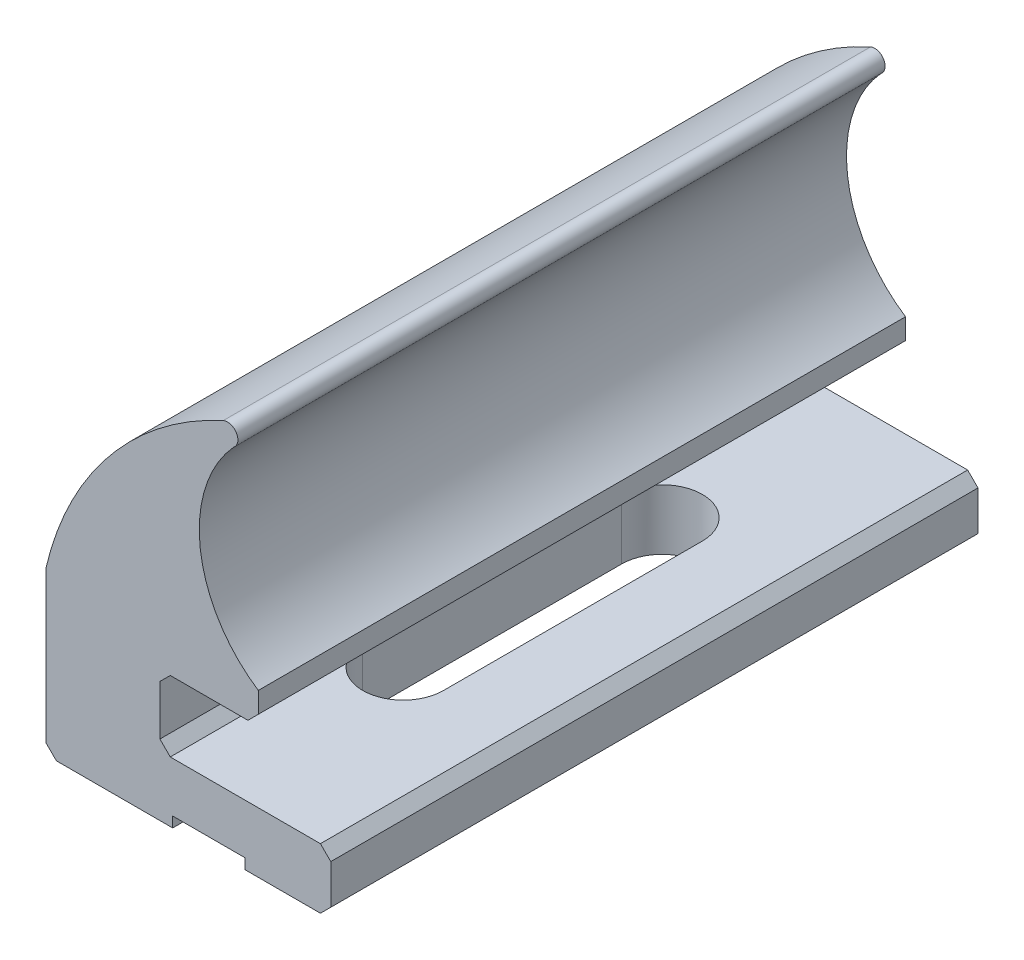
ISO-10303-21;
HEADER;
FILE_DESCRIPTION(('STEP AP214'),'2;1');
FILE_NAME('part.step','',(''),(''),'','','');
FILE_SCHEMA(('AUTOMOTIVE_DESIGN { 1 0 10303 214 1 1 1 1 }'));
ENDSEC;
DATA;
#1=APPLICATION_CONTEXT('core data for automotive mechanical design processes');
#2=APPLICATION_PROTOCOL_DEFINITION('international standard','automotive_design',2000,#1);
#3=PRODUCT_CONTEXT('',#1,'mechanical');
#4=PRODUCT('Part','Part','',(#3));
#5=PRODUCT_RELATED_PRODUCT_CATEGORY('part','',(#4));
#6=PRODUCT_DEFINITION_FORMATION('','',#4);
#7=PRODUCT_DEFINITION_CONTEXT('part definition',#1,'design');
#8=PRODUCT_DEFINITION('design','',#6,#7);
#9=PRODUCT_DEFINITION_SHAPE('','',#8);
#10=(LENGTH_UNIT() NAMED_UNIT(*) SI_UNIT(.MILLI.,.METRE.));
#11=(NAMED_UNIT(*) PLANE_ANGLE_UNIT() SI_UNIT($,.RADIAN.));
#12=(NAMED_UNIT(*) SI_UNIT($,.STERADIAN.) SOLID_ANGLE_UNIT());
#13=UNCERTAINTY_MEASURE_WITH_UNIT(LENGTH_MEASURE(1.E-05),#10,'distance_accuracy_value','');
#14=(GEOMETRIC_REPRESENTATION_CONTEXT(3) GLOBAL_UNCERTAINTY_ASSIGNED_CONTEXT((#13)) GLOBAL_UNIT_ASSIGNED_CONTEXT((#10,
#11,#12)) REPRESENTATION_CONTEXT('',''));
#15=CARTESIAN_POINT('',(0.,0.,0.));
#16=DIRECTION('',(0.,0.,1.));
#17=DIRECTION('',(1.,0.,0.));
#18=AXIS2_PLACEMENT_3D('',#15,#16,#17);
#19=CARTESIAN_POINT('',(0.,0.,-31.75));
#20=DIRECTION('',(0.,0.,-1.));
#21=DIRECTION('',(-1.,0.,0.));
#22=AXIS2_PLACEMENT_3D('',#19,#20,#21);
#23=PLANE('',#22);
#24=DIRECTION('',(1.,0.,0.));
#25=VECTOR('',#24,1.);
#26=CARTESIAN_POINT('',(0.,12.7,-31.75));
#27=LINE('',#26,#25);
#28=CARTESIAN_POINT('',(0.508000000000001,12.7,-31.75));
#29=VERTEX_POINT('',#28);
#30=CARTESIAN_POINT('',(13.462,12.7,-31.75));
#31=VERTEX_POINT('',#30);
#32=EDGE_CURVE('E275',#29,#31,#27,.T.);
#33=ORIENTED_EDGE('',*,*,#32,.F.);
#34=DIRECTION('',(0.70710678118655,-0.707106781186545,0.));
#35=VECTOR('',#34,1.);
#36=CARTESIAN_POINT('',(6.604,6.60400000000004,-31.75));
#37=LINE('',#36,#35);
#38=CARTESIAN_POINT('',(0.,13.208,-31.75));
#39=VERTEX_POINT('',#38);
#40=EDGE_CURVE('E315',#29,#39,#37,.F.);
#41=ORIENTED_EDGE('',*,*,#40,.T.);
#42=DIRECTION('',(0.,-1.,0.));
#43=VECTOR('',#42,1.);
#44=CARTESIAN_POINT('',(0.,12.7,-31.75));
#45=LINE('',#44,#43);
#46=CARTESIAN_POINT('',(0.,20.6433343911841,-31.75));
#47=VERTEX_POINT('',#46);
#48=EDGE_CURVE('E278',#47,#39,#45,.T.);
#49=ORIENTED_EDGE('',*,*,#48,.F.);
#50=CARTESIAN_POINT('',(15.1248827447145,17.1079918016303,-31.75));
#51=DIRECTION('',(0.,0.,-1.));
#52=DIRECTION('',(-1.,0.,0.));
#53=AXIS2_PLACEMENT_3D('',#50,#51,#52);
#54=CIRCLE('',#53,15.5325698217287);
#55=CARTESIAN_POINT('',(8.69449523293565,31.2469748525868,-31.75));
#56=VERTEX_POINT('',#55);
#57=EDGE_CURVE('E282',#56,#47,#54,.F.);
#58=ORIENTED_EDGE('',*,*,#57,.F.);
#59=CARTESIAN_POINT('',(8.90513301742173,30.7838295041479,-31.75));
#60=DIRECTION('',(0.,0.,-1.));
#61=DIRECTION('',(-1.,0.,0.));
#62=AXIS2_PLACEMENT_3D('',#59,#60,#61);
#63=CIRCLE('',#62,0.508794545994505);
#64=CARTESIAN_POINT('',(9.20630180988808,30.3737450634798,-31.75));
#65=VERTEX_POINT('',#64);
#66=EDGE_CURVE('E286',#65,#56,#63,.F.);
#67=ORIENTED_EDGE('',*,*,#66,.F.);
#68=CARTESIAN_POINT('',(13.97,26.0248429330683,-31.75));
#69=DIRECTION('',(0.,0.,-1.));
#70=DIRECTION('',(-1.,0.,0.));
#71=AXIS2_PLACEMENT_3D('',#68,#69,#70);
#72=CIRCLE('',#71,6.45025349783811);
#73=CARTESIAN_POINT('',(10.414,20.6433343911841,-31.75));
#74=VERTEX_POINT('',#73);
#75=EDGE_CURVE('E255',#74,#65,#72,.T.);
#76=ORIENTED_EDGE('',*,*,#75,.F.);
#77=DIRECTION('',(0.,1.,0.));
#78=VECTOR('',#77,1.);
#79=CARTESIAN_POINT('',(10.414,19.1193343911841,-31.75));
#80=LINE('',#79,#78);
#81=CARTESIAN_POINT('',(10.414,19.6273343911841,-31.75));
#82=VERTEX_POINT('',#81);
#83=EDGE_CURVE('E260',#82,#74,#80,.T.);
#84=ORIENTED_EDGE('',*,*,#83,.F.);
#85=DIRECTION('',(0.707106781186543,0.707106781186552,0.));
#86=VECTOR('',#85,1.);
#87=CARTESIAN_POINT('',(-4.60666719559199,4.60666719559193,-31.75));
#88=LINE('',#87,#86);
#89=CARTESIAN_POINT('',(9.906,19.1193343911841,-31.75));
#90=VERTEX_POINT('',#89);
#91=EDGE_CURVE('E313',#82,#90,#88,.F.);
#92=ORIENTED_EDGE('',*,*,#91,.T.);
#93=DIRECTION('',(1.,0.,0.));
#94=VECTOR('',#93,1.);
#95=CARTESIAN_POINT('',(5.588,19.1193343911841,-31.75));
#96=LINE('',#95,#94);
#97=CARTESIAN_POINT('',(6.09599999999999,19.1193343911841,-31.75));
#98=VERTEX_POINT('',#97);
#99=EDGE_CURVE('E263',#98,#90,#96,.T.);
#100=ORIENTED_EDGE('',*,*,#99,.F.);
#101=DIRECTION('',(0.707106781186543,0.707106781186552,0.));
#102=VECTOR('',#101,1.);
#103=CARTESIAN_POINT('',(5.588,18.6113343911841,-31.75));
#104=LINE('',#103,#102);
#105=CARTESIAN_POINT('',(5.588,18.6113343911841,-31.75));
#106=VERTEX_POINT('',#105);
#107=EDGE_CURVE('E11',#98,#106,#104,.F.);
#108=ORIENTED_EDGE('',*,*,#107,.T.);
#109=DIRECTION('',(0.,1.,0.));
#110=VECTOR('',#109,1.);
#111=CARTESIAN_POINT('',(5.588,15.6566370525685,-31.75));
#112=LINE('',#111,#110);
#113=CARTESIAN_POINT('',(5.588,16.1646370525685,-31.75));
#114=VERTEX_POINT('',#113);
#115=EDGE_CURVE('E266',#114,#106,#112,.T.);
#116=ORIENTED_EDGE('',*,*,#115,.F.);
#117=DIRECTION('',(-0.707106781186552,0.707106781186543,0.));
#118=VECTOR('',#117,1.);
#119=CARTESIAN_POINT('',(6.096,15.6566370525685,-31.75));
#120=LINE('',#119,#118);
#121=CARTESIAN_POINT('',(6.096,15.6566370525685,-31.75));
#122=VERTEX_POINT('',#121);
#123=EDGE_CURVE('E342',#114,#122,#120,.F.);
#124=ORIENTED_EDGE('',*,*,#123,.T.);
#125=DIRECTION('',(-1.,0.,0.));
#126=VECTOR('',#125,1.);
#127=CARTESIAN_POINT('',(13.97,15.6566370525685,-31.75));
#128=LINE('',#127,#126);
#129=CARTESIAN_POINT('',(13.462,15.6566370525685,-31.75));
#130=VERTEX_POINT('',#129);
#131=EDGE_CURVE('E269',#130,#122,#128,.T.);
#132=ORIENTED_EDGE('',*,*,#131,.F.);
#133=DIRECTION('',(-0.707106781186555,0.70710678118654,0.));
#134=VECTOR('',#133,1.);
#135=CARTESIAN_POINT('',(14.5593185262841,14.5593185262844,-31.75));
#136=LINE('',#135,#134);
#137=CARTESIAN_POINT('',(13.97,15.1486370525685,-31.75));
#138=VERTEX_POINT('',#137);
#139=EDGE_CURVE('E309',#130,#138,#136,.F.);
#140=ORIENTED_EDGE('',*,*,#139,.T.);
#141=DIRECTION('',(0.,1.,0.));
#142=VECTOR('',#141,1.);
#143=CARTESIAN_POINT('',(13.97,12.7,-31.75));
#144=LINE('',#143,#142);
#145=CARTESIAN_POINT('',(13.97,13.208,-31.75));
#146=VERTEX_POINT('',#145);
#147=EDGE_CURVE('E272',#146,#138,#144,.T.);
#148=ORIENTED_EDGE('',*,*,#147,.F.);
#149=DIRECTION('',(0.707106781186545,0.70710678118655,0.));
#150=VECTOR('',#149,1.);
#151=CARTESIAN_POINT('',(0.381000000000043,-0.38100000000004,-31.75));
#152=LINE('',#151,#150);
#153=EDGE_CURVE('E311',#146,#31,#152,.F.);
#154=ORIENTED_EDGE('',*,*,#153,.T.);
#155=EDGE_LOOP('',(#33,#41,#49,#58,#67,#76,#84,#92,#100,#108,#116,#124,#132,#140,#148,#154));
#156=FACE_BOUND('',#155,.T.);
#157=ADVANCED_FACE('F39',(#156),#23,.T.);
#158=CARTESIAN_POINT('',(13.97,26.0248429330683,0.));
#159=DIRECTION('',(0.,0.,1.));
#160=DIRECTION('',(1.,0.,0.));
#161=AXIS2_PLACEMENT_3D('',#158,#159,#160);
#162=PLANE('',#161);
#163=DIRECTION('',(0.,-1.,0.));
#164=VECTOR('',#163,1.);
#165=CARTESIAN_POINT('',(6.21522901844928,12.192,0.));
#166=LINE('',#165,#164);
#167=CARTESIAN_POINT('',(6.21522901844928,13.208,0.));
#168=VERTEX_POINT('',#167);
#169=CARTESIAN_POINT('',(6.21522901844928,12.7,0.));
#170=VERTEX_POINT('',#169);
#171=EDGE_CURVE('E206',#168,#170,#166,.T.);
#172=ORIENTED_EDGE('',*,*,#171,.F.);
#173=DIRECTION('',(-1.,0.,0.));
#174=VECTOR('',#173,1.);
#175=CARTESIAN_POINT('',(6.21522901844928,13.208,0.));
#176=LINE('',#175,#174);
#177=CARTESIAN_POINT('',(9.77122901844928,13.208,0.));
#178=VERTEX_POINT('',#177);
#179=EDGE_CURVE('E218',#178,#168,#176,.T.);
#180=ORIENTED_EDGE('',*,*,#179,.F.);
#181=DIRECTION('',(0.,1.,0.));
#182=VECTOR('',#181,1.);
#183=CARTESIAN_POINT('',(9.77122901844928,12.192,0.));
#184=LINE('',#183,#182);
#185=CARTESIAN_POINT('',(9.77122901844928,12.7,0.));
#186=VERTEX_POINT('',#185);
#187=EDGE_CURVE('E639',#186,#178,#184,.T.);
#188=ORIENTED_EDGE('',*,*,#187,.F.);
#189=DIRECTION('',(1.,0.,0.));
#190=VECTOR('',#189,1.);
#191=CARTESIAN_POINT('',(0.,12.7,0.));
#192=LINE('',#191,#190);
#193=CARTESIAN_POINT('',(13.462,12.7,0.));
#194=VERTEX_POINT('',#193);
#195=EDGE_CURVE('E234',#186,#194,#192,.T.);
#196=ORIENTED_EDGE('',*,*,#195,.T.);
#197=DIRECTION('',(-0.707106781186545,-0.70710678118655,0.));
#198=VECTOR('',#197,1.);
#199=CARTESIAN_POINT('',(20.3784214665342,19.6164214665342,0.));
#200=LINE('',#199,#198);
#201=CARTESIAN_POINT('',(13.97,13.208,0.));
#202=VERTEX_POINT('',#201);
#203=EDGE_CURVE('E299',#194,#202,#200,.F.);
#204=ORIENTED_EDGE('',*,*,#203,.T.);
#205=DIRECTION('',(0.,1.,0.));
#206=VECTOR('',#205,1.);
#207=CARTESIAN_POINT('',(13.97,12.7,0.));
#208=LINE('',#207,#206);
#209=CARTESIAN_POINT('',(13.97,15.1486370525685,0.));
#210=VERTEX_POINT('',#209);
#211=EDGE_CURVE('E233',#202,#210,#208,.T.);
#212=ORIENTED_EDGE('',*,*,#211,.T.);
#213=DIRECTION('',(0.707106781186555,-0.70710678118654,0.));
#214=VECTOR('',#213,1.);
#215=CARTESIAN_POINT('',(8.53189705975008,20.5867399928183,0.));
#216=LINE('',#215,#214);
#217=CARTESIAN_POINT('',(13.462,15.6566370525685,0.));
#218=VERTEX_POINT('',#217);
#219=EDGE_CURVE('E297',#210,#218,#216,.F.);
#220=ORIENTED_EDGE('',*,*,#219,.T.);
#221=DIRECTION('',(-1.,0.,0.));
#222=VECTOR('',#221,1.);
#223=CARTESIAN_POINT('',(13.97,15.6566370525685,0.));
#224=LINE('',#223,#222);
#225=CARTESIAN_POINT('',(6.096,15.6566370525685,0.));
#226=VERTEX_POINT('',#225);
#227=EDGE_CURVE('E237',#218,#226,#224,.T.);
#228=ORIENTED_EDGE('',*,*,#227,.T.);
#229=DIRECTION('',(0.707106781186552,-0.707106781186543,0.));
#230=VECTOR('',#229,1.);
#231=CARTESIAN_POINT('',(6.096,15.6566370525685,0.));
#232=LINE('',#231,#230);
#233=CARTESIAN_POINT('',(5.588,16.1646370525685,0.));
#234=VERTEX_POINT('',#233);
#235=EDGE_CURVE('E340',#226,#234,#232,.F.);
#236=ORIENTED_EDGE('',*,*,#235,.T.);
#237=DIRECTION('',(0.,1.,0.));
#238=VECTOR('',#237,1.);
#239=CARTESIAN_POINT('',(5.588,15.6566370525685,0.));
#240=LINE('',#239,#238);
#241=CARTESIAN_POINT('',(5.588,18.6113343911841,0.));
#242=VERTEX_POINT('',#241);
#243=EDGE_CURVE('E347',#234,#242,#240,.T.);
#244=ORIENTED_EDGE('',*,*,#243,.T.);
#245=DIRECTION('',(-0.707106781186543,-0.707106781186552,0.));
#246=VECTOR('',#245,1.);
#247=CARTESIAN_POINT('',(5.588,18.6113343911841,0.));
#248=LINE('',#247,#246);
#249=CARTESIAN_POINT('',(6.09599999999999,19.1193343911841,0.));
#250=VERTEX_POINT('',#249);
#251=EDGE_CURVE('E48',#242,#250,#248,.F.);
#252=ORIENTED_EDGE('',*,*,#251,.T.);
#253=DIRECTION('',(1.,0.,0.));
#254=VECTOR('',#253,1.);
#255=CARTESIAN_POINT('',(5.588,19.1193343911841,0.));
#256=LINE('',#255,#254);
#257=CARTESIAN_POINT('',(9.906,19.1193343911841,0.));
#258=VERTEX_POINT('',#257);
#259=EDGE_CURVE('E259',#250,#258,#256,.T.);
#260=ORIENTED_EDGE('',*,*,#259,.T.);
#261=DIRECTION('',(-0.707106781186543,-0.707106781186552,0.));
#262=VECTOR('',#261,1.);
#263=CARTESIAN_POINT('',(15.3907542709421,24.6040886621263,0.));
#264=LINE('',#263,#262);
#265=CARTESIAN_POINT('',(10.414,19.6273343911841,0.));
#266=VERTEX_POINT('',#265);
#267=EDGE_CURVE('E301',#258,#266,#264,.F.);
#268=ORIENTED_EDGE('',*,*,#267,.T.);
#269=DIRECTION('',(0.,1.,0.));
#270=VECTOR('',#269,1.);
#271=CARTESIAN_POINT('',(10.414,19.1193343911841,0.));
#272=LINE('',#271,#270);
#273=CARTESIAN_POINT('',(10.414,20.6433343911841,0.));
#274=VERTEX_POINT('',#273);
#275=EDGE_CURVE('E252',#266,#274,#272,.T.);
#276=ORIENTED_EDGE('',*,*,#275,.T.);
#277=CARTESIAN_POINT('',(13.97,26.0248429330683,0.));
#278=DIRECTION('',(0.,0.,-1.));
#279=DIRECTION('',(1.,0.,0.));
#280=AXIS2_PLACEMENT_3D('',#277,#278,#279);
#281=CIRCLE('',#280,6.45025349783811);
#282=CARTESIAN_POINT('',(9.20630180988808,30.3737450634798,0.));
#283=VERTEX_POINT('',#282);
#284=EDGE_CURVE('E249',#274,#283,#281,.T.);
#285=ORIENTED_EDGE('',*,*,#284,.T.);
#286=CARTESIAN_POINT('',(8.90513301742173,30.7838295041479,0.));
#287=DIRECTION('',(0.,0.,1.));
#288=DIRECTION('',(-1.,0.,0.));
#289=AXIS2_PLACEMENT_3D('',#286,#287,#288);
#290=CIRCLE('',#289,0.508794545994505);
#291=CARTESIAN_POINT('',(8.69449523293565,31.2469748525868,0.));
#292=VERTEX_POINT('',#291);
#293=EDGE_CURVE('E246',#283,#292,#290,.T.);
#294=ORIENTED_EDGE('',*,*,#293,.T.);
#295=CARTESIAN_POINT('',(15.1248827447145,17.1079918016303,0.));
#296=DIRECTION('',(0.,0.,1.));
#297=DIRECTION('',(-1.,0.,0.));
#298=AXIS2_PLACEMENT_3D('',#295,#296,#297);
#299=CIRCLE('',#298,15.5325698217287);
#300=CARTESIAN_POINT('',(0.,20.6433343911841,0.));
#301=VERTEX_POINT('',#300);
#302=EDGE_CURVE('E243',#292,#301,#299,.T.);
#303=ORIENTED_EDGE('',*,*,#302,.T.);
#304=DIRECTION('',(0.,-1.,0.));
#305=VECTOR('',#304,1.);
#306=CARTESIAN_POINT('',(0.,12.7,0.));
#307=LINE('',#306,#305);
#308=CARTESIAN_POINT('',(0.,13.208,0.));
#309=VERTEX_POINT('',#308);
#310=EDGE_CURVE('E239',#301,#309,#307,.T.);
#311=ORIENTED_EDGE('',*,*,#310,.T.);
#312=DIRECTION('',(-0.70710678118655,0.707106781186545,0.));
#313=VECTOR('',#312,1.);
#314=CARTESIAN_POINT('',(0.576578533465875,12.6314214665341,0.));
#315=LINE('',#314,#313);
#316=CARTESIAN_POINT('',(0.508000000000001,12.7,0.));
#317=VERTEX_POINT('',#316);
#318=EDGE_CURVE('E232',#309,#317,#315,.F.);
#319=ORIENTED_EDGE('',*,*,#318,.T.);
#320=EDGE_CURVE('E224',#317,#170,#192,.T.);
#321=ORIENTED_EDGE('',*,*,#320,.T.);
#322=EDGE_LOOP('',(#172,#180,#188,#196,#204,#212,#220,#228,#236,#244,#252,#260,#268,#276,#285,
#294,#303,#311,#319,#321));
#323=FACE_BOUND('',#322,.T.);
#324=ADVANCED_FACE('F230',(#323),#162,.T.);
#325=CARTESIAN_POINT('',(13.97,26.0248429330683,-55.0061082098862));
#326=DIRECTION('',(0.,0.,1.));
#327=DIRECTION('',(1.,0.,0.));
#328=AXIS2_PLACEMENT_3D('',#325,#326,#327);
#329=CYLINDRICAL_SURFACE('',#328,6.45025349783811);
#330=DIRECTION('',(0.,0.,1.));
#331=VECTOR('',#330,1.);
#332=CARTESIAN_POINT('',(10.414,20.6433343911841,-55.0061082098862));
#333=LINE('',#332,#331);
#334=EDGE_CURVE('E262',#74,#274,#333,.T.);
#335=ORIENTED_EDGE('',*,*,#334,.F.);
#336=ORIENTED_EDGE('',*,*,#75,.T.);
#337=DIRECTION('',(0.,0.,1.));
#338=VECTOR('',#337,1.);
#339=CARTESIAN_POINT('',(9.20630180988808,30.3737450634798,-55.0061082098862));
#340=LINE('',#339,#338);
#341=EDGE_CURVE('E258',#65,#283,#340,.T.);
#342=ORIENTED_EDGE('',*,*,#341,.T.);
#343=ORIENTED_EDGE('',*,*,#284,.F.);
#344=EDGE_LOOP('',(#335,#336,#342,#343));
#345=FACE_BOUND('',#344,.T.);
#346=ADVANCED_FACE('F414',(#345),#329,.F.);
#347=CARTESIAN_POINT('',(8.90513301742173,30.7838295041479,-55.0061082098862));
#348=DIRECTION('',(0.,0.,1.));
#349=DIRECTION('',(1.,0.,0.));
#350=AXIS2_PLACEMENT_3D('',#347,#348,#349);
#351=CYLINDRICAL_SURFACE('',#350,0.508794545994505);
#352=ORIENTED_EDGE('',*,*,#341,.F.);
#353=ORIENTED_EDGE('',*,*,#66,.T.);
#354=DIRECTION('',(0.,0.,1.));
#355=VECTOR('',#354,1.);
#356=CARTESIAN_POINT('',(8.69449523293565,31.2469748525868,-55.0061082098862));
#357=LINE('',#356,#355);
#358=EDGE_CURVE('E285',#56,#292,#357,.T.);
#359=ORIENTED_EDGE('',*,*,#358,.T.);
#360=ORIENTED_EDGE('',*,*,#293,.F.);
#361=EDGE_LOOP('',(#352,#353,#359,#360));
#362=FACE_BOUND('',#361,.T.);
#363=ADVANCED_FACE('F411',(#362),#351,.T.);
#364=CARTESIAN_POINT('',(15.1248827447145,17.1079918016303,-55.0061082098862));
#365=DIRECTION('',(0.,0.,1.));
#366=DIRECTION('',(1.,0.,0.));
#367=AXIS2_PLACEMENT_3D('',#364,#365,#366);
#368=CYLINDRICAL_SURFACE('',#367,15.5325698217287);
#369=ORIENTED_EDGE('',*,*,#358,.F.);
#370=ORIENTED_EDGE('',*,*,#57,.T.);
#371=DIRECTION('',(0.,0.,1.));
#372=VECTOR('',#371,1.);
#373=CARTESIAN_POINT('',(0.,20.6433343911841,-55.0061082098862));
#374=LINE('',#373,#372);
#375=EDGE_CURVE('E281',#47,#301,#374,.T.);
#376=ORIENTED_EDGE('',*,*,#375,.T.);
#377=ORIENTED_EDGE('',*,*,#302,.F.);
#378=EDGE_LOOP('',(#369,#370,#376,#377));
#379=FACE_BOUND('',#378,.T.);
#380=ADVANCED_FACE('F404',(#379),#368,.T.);
#381=CARTESIAN_POINT('',(0.,12.7,-55.0061082098862));
#382=DIRECTION('',(-1.,0.,0.));
#383=DIRECTION('',(0.,0.,1.));
#384=AXIS2_PLACEMENT_3D('',#381,#382,#383);
#385=PLANE('',#384);
#386=ORIENTED_EDGE('',*,*,#48,.T.);
#387=DIRECTION('',(0.,0.,1.));
#388=VECTOR('',#387,1.);
#389=CARTESIAN_POINT('',(0.,13.208,-55.0061082098862));
#390=LINE('',#389,#388);
#391=EDGE_CURVE('E294',#39,#309,#390,.T.);
#392=ORIENTED_EDGE('',*,*,#391,.T.);
#393=ORIENTED_EDGE('',*,*,#310,.F.);
#394=ORIENTED_EDGE('',*,*,#375,.F.);
#395=EDGE_LOOP('',(#386,#392,#393,#394));
#396=FACE_BOUND('',#395,.T.);
#397=ADVANCED_FACE('F399',(#396),#385,.T.);
#398=CARTESIAN_POINT('',(0.,12.7,-55.0061082098862));
#399=DIRECTION('',(0.,-1.,0.));
#400=DIRECTION('',(1.,0.,0.));
#401=AXIS2_PLACEMENT_3D('',#398,#399,#400);
#402=PLANE('',#401);
#403=DIRECTION('',(0.,0.,1.));
#404=VECTOR('',#403,1.);
#405=CARTESIAN_POINT('',(6.21522901844928,12.7,-31.751));
#406=LINE('',#405,#404);
#407=CARTESIAN_POINT('',(6.21522901844928,12.7,-8.65100375286847));
#408=VERTEX_POINT('',#407);
#409=EDGE_CURVE('E210',#408,#170,#406,.T.);
#410=ORIENTED_EDGE('',*,*,#409,.T.);
#411=ORIENTED_EDGE('',*,*,#320,.F.);
#412=DIRECTION('',(0.,0.,-1.));
#413=VECTOR('',#412,1.);
#414=CARTESIAN_POINT('',(0.508000000000001,12.7,-55.0061082098862));
#415=LINE('',#414,#413);
#416=EDGE_CURVE('E307',#317,#29,#415,.T.);
#417=ORIENTED_EDGE('',*,*,#416,.T.);
#418=ORIENTED_EDGE('',*,*,#32,.T.);
#419=DIRECTION('',(0.,0.,1.));
#420=VECTOR('',#419,1.);
#421=CARTESIAN_POINT('',(13.462,12.7,-55.0061082098862));
#422=LINE('',#421,#420);
#423=EDGE_CURVE('E304',#31,#194,#422,.T.);
#424=ORIENTED_EDGE('',*,*,#423,.T.);
#425=ORIENTED_EDGE('',*,*,#195,.F.);
#426=DIRECTION('',(0.,0.,-1.));
#427=VECTOR('',#426,1.);
#428=CARTESIAN_POINT('',(9.77122901844928,12.7,-31.751));
#429=LINE('',#428,#427);
#430=CARTESIAN_POINT('',(9.77122901844928,12.7,-8.65100375286846));
#431=VERTEX_POINT('',#430);
#432=EDGE_CURVE('E228',#186,#431,#429,.T.);
#433=ORIENTED_EDGE('',*,*,#432,.T.);
#434=CARTESIAN_POINT('',(7.99322901844928,12.7,-9.525));
#435=DIRECTION('',(0.,-1.,0.));
#436=DIRECTION('',(1.,0.,0.));
#437=AXIS2_PLACEMENT_3D('',#434,#435,#436);
#438=CIRCLE('',#437,1.9812);
#439=CARTESIAN_POINT('',(9.97442901844928,12.7,-9.525));
#440=VERTEX_POINT('',#439);
#441=EDGE_CURVE('E662',#440,#431,#438,.T.);
#442=ORIENTED_EDGE('',*,*,#441,.F.);
#443=DIRECTION('',(0.,0.,1.));
#444=VECTOR('',#443,1.);
#445=CARTESIAN_POINT('',(9.97442901844929,12.7,-22.225));
#446=LINE('',#445,#444);
#447=CARTESIAN_POINT('',(9.97442901844929,12.7,-22.225));
#448=VERTEX_POINT('',#447);
#449=EDGE_CURVE('E665',#448,#440,#446,.T.);
#450=ORIENTED_EDGE('',*,*,#449,.F.);
#451=CARTESIAN_POINT('',(7.99322901844928,12.7,-22.225));
#452=DIRECTION('',(0.,-1.,0.));
#453=DIRECTION('',(1.,0.,0.));
#454=AXIS2_PLACEMENT_3D('',#451,#452,#453);
#455=CIRCLE('',#454,1.9812);
#456=CARTESIAN_POINT('',(6.01202901844928,12.7,-22.225));
#457=VERTEX_POINT('',#456);
#458=EDGE_CURVE('E63',#457,#448,#455,.T.);
#459=ORIENTED_EDGE('',*,*,#458,.F.);
#460=DIRECTION('',(0.,0.,-1.));
#461=VECTOR('',#460,1.);
#462=CARTESIAN_POINT('',(6.01202901844928,12.7,-22.225));
#463=LINE('',#462,#461);
#464=CARTESIAN_POINT('',(6.01202901844928,12.7,-9.525));
#465=VERTEX_POINT('',#464);
#466=EDGE_CURVE('E658',#465,#457,#463,.T.);
#467=ORIENTED_EDGE('',*,*,#466,.F.);
#468=EDGE_CURVE('E227',#408,#465,#438,.T.);
#469=ORIENTED_EDGE('',*,*,#468,.F.);
#470=EDGE_LOOP('',(#410,#411,#417,#418,#424,#425,#433,#442,#450,#459,#467,#469));
#471=FACE_BOUND('',#470,.T.);
#472=ADVANCED_FACE('F223',(#471),#402,.T.);
#473=CARTESIAN_POINT('',(13.97,12.7,-55.0061082098862));
#474=DIRECTION('',(1.,0.,0.));
#475=DIRECTION('',(0.,0.,-1.));
#476=AXIS2_PLACEMENT_3D('',#473,#474,#475);
#477=PLANE('',#476);
#478=ORIENTED_EDGE('',*,*,#211,.F.);
#479=DIRECTION('',(0.,0.,-1.));
#480=VECTOR('',#479,1.);
#481=CARTESIAN_POINT('',(13.97,13.208,-55.0061082098862));
#482=LINE('',#481,#480);
#483=EDGE_CURVE('E338',#202,#146,#482,.T.);
#484=ORIENTED_EDGE('',*,*,#483,.T.);
#485=ORIENTED_EDGE('',*,*,#147,.T.);
#486=DIRECTION('',(0.,0.,1.));
#487=VECTOR('',#486,1.);
#488=CARTESIAN_POINT('',(13.97,15.1486370525685,-55.0061082098862));
#489=LINE('',#488,#487);
#490=EDGE_CURVE('E335',#138,#210,#489,.T.);
#491=ORIENTED_EDGE('',*,*,#490,.T.);
#492=EDGE_LOOP('',(#478,#484,#485,#491));
#493=FACE_BOUND('',#492,.T.);
#494=ADVANCED_FACE('F386',(#493),#477,.T.);
#495=CARTESIAN_POINT('',(13.97,15.6566370525685,-55.0061082098862));
#496=DIRECTION('',(0.,1.,0.));
#497=DIRECTION('',(0.,0.,1.));
#498=AXIS2_PLACEMENT_3D('',#495,#496,#497);
#499=PLANE('',#498);
#500=CARTESIAN_POINT('',(7.99322901844928,15.6566370525685,-22.225));
#501=DIRECTION('',(0.,1.,0.));
#502=DIRECTION('',(0.,0.,1.));
#503=AXIS2_PLACEMENT_3D('',#500,#501,#502);
#504=CIRCLE('',#503,1.9812);
#505=CARTESIAN_POINT('',(6.096,15.6566370525685,-22.7956798503136));
#506=VERTEX_POINT('',#505);
#507=CARTESIAN_POINT('',(9.97442901844929,15.6566370525685,-22.225));
#508=VERTEX_POINT('',#507);
#509=EDGE_CURVE('E650',#506,#508,#504,.F.);
#510=ORIENTED_EDGE('',*,*,#509,.T.);
#511=DIRECTION('',(0.,0.,1.));
#512=VECTOR('',#511,1.);
#513=CARTESIAN_POINT('',(9.97442901844929,15.6566370525685,-22.225));
#514=LINE('',#513,#512);
#515=CARTESIAN_POINT('',(9.97442901844928,15.6566370525685,-9.525));
#516=VERTEX_POINT('',#515);
#517=EDGE_CURVE('E653',#508,#516,#514,.T.);
#518=ORIENTED_EDGE('',*,*,#517,.T.);
#519=CARTESIAN_POINT('',(7.99322901844928,15.6566370525685,-9.525));
#520=DIRECTION('',(0.,1.,0.));
#521=DIRECTION('',(0.,0.,1.));
#522=AXIS2_PLACEMENT_3D('',#519,#520,#521);
#523=CIRCLE('',#522,1.9812);
#524=CARTESIAN_POINT('',(6.096,15.6566370525685,-8.95432014968637));
#525=VERTEX_POINT('',#524);
#526=EDGE_CURVE('E674',#516,#525,#523,.F.);
#527=ORIENTED_EDGE('',*,*,#526,.T.);
#528=DIRECTION('',(0.,0.,1.));
#529=VECTOR('',#528,1.);
#530=CARTESIAN_POINT('',(6.096,15.6566370525685,0.));
#531=LINE('',#530,#529);
#532=EDGE_CURVE('E326',#525,#226,#531,.T.);
#533=ORIENTED_EDGE('',*,*,#532,.T.);
#534=ORIENTED_EDGE('',*,*,#227,.F.);
#535=DIRECTION('',(0.,0.,-1.));
#536=VECTOR('',#535,1.);
#537=CARTESIAN_POINT('',(13.462,15.6566370525685,-55.0061082098862));
#538=LINE('',#537,#536);
#539=EDGE_CURVE('E324',#218,#130,#538,.T.);
#540=ORIENTED_EDGE('',*,*,#539,.T.);
#541=ORIENTED_EDGE('',*,*,#131,.T.);
#542=EDGE_CURVE('E327',#122,#506,#531,.T.);
#543=ORIENTED_EDGE('',*,*,#542,.T.);
#544=EDGE_LOOP('',(#510,#518,#527,#533,#534,#540,#541,#543));
#545=FACE_BOUND('',#544,.T.);
#546=ADVANCED_FACE('F377',(#545),#499,.T.);
#547=CARTESIAN_POINT('',(5.588,15.6566370525685,-55.0061082098862));
#548=DIRECTION('',(1.,0.,0.));
#549=DIRECTION('',(0.,1.,0.));
#550=AXIS2_PLACEMENT_3D('',#547,#548,#549);
#551=PLANE('',#550);
#552=ORIENTED_EDGE('',*,*,#243,.F.);
#553=DIRECTION('',(0.,0.,-1.));
#554=VECTOR('',#553,1.);
#555=CARTESIAN_POINT('',(5.588,16.1646370525685,-31.75));
#556=LINE('',#555,#554);
#557=EDGE_CURVE('E333',#234,#114,#556,.T.);
#558=ORIENTED_EDGE('',*,*,#557,.T.);
#559=ORIENTED_EDGE('',*,*,#115,.T.);
#560=DIRECTION('',(0.,0.,1.));
#561=VECTOR('',#560,1.);
#562=CARTESIAN_POINT('',(5.588,18.6113343911841,0.));
#563=LINE('',#562,#561);
#564=EDGE_CURVE('E330',#106,#242,#563,.T.);
#565=ORIENTED_EDGE('',*,*,#564,.T.);
#566=EDGE_LOOP('',(#552,#558,#559,#565));
#567=FACE_BOUND('',#566,.T.);
#568=ADVANCED_FACE('F363',(#567),#551,.T.);
#569=CARTESIAN_POINT('',(5.588,19.1193343911841,-55.0061082098862));
#570=DIRECTION('',(0.,-1.,0.));
#571=DIRECTION('',(0.,0.,-1.));
#572=AXIS2_PLACEMENT_3D('',#569,#570,#571);
#573=PLANE('',#572);
#574=ORIENTED_EDGE('',*,*,#99,.T.);
#575=DIRECTION('',(0.,0.,1.));
#576=VECTOR('',#575,1.);
#577=CARTESIAN_POINT('',(9.906,19.1193343911841,-55.0061082098862));
#578=LINE('',#577,#576);
#579=EDGE_CURVE('E319',#90,#258,#578,.T.);
#580=ORIENTED_EDGE('',*,*,#579,.T.);
#581=ORIENTED_EDGE('',*,*,#259,.F.);
#582=DIRECTION('',(0.,0.,-1.));
#583=VECTOR('',#582,1.);
#584=CARTESIAN_POINT('',(6.09599999999999,19.1193343911841,-31.75));
#585=LINE('',#584,#583);
#586=EDGE_CURVE('E317',#250,#98,#585,.T.);
#587=ORIENTED_EDGE('',*,*,#586,.T.);
#588=EDGE_LOOP('',(#574,#580,#581,#587));
#589=FACE_BOUND('',#588,.T.);
#590=ADVANCED_FACE('F352',(#589),#573,.T.);
#591=CARTESIAN_POINT('',(10.414,19.1193343911841,-55.0061082098862));
#592=DIRECTION('',(1.,0.,0.));
#593=DIRECTION('',(0.,0.,-1.));
#594=AXIS2_PLACEMENT_3D('',#591,#592,#593);
#595=PLANE('',#594);
#596=ORIENTED_EDGE('',*,*,#275,.F.);
#597=DIRECTION('',(0.,0.,-1.));
#598=VECTOR('',#597,1.);
#599=CARTESIAN_POINT('',(10.414,19.6273343911841,-55.0061082098862));
#600=LINE('',#599,#598);
#601=EDGE_CURVE('E322',#266,#82,#600,.T.);
#602=ORIENTED_EDGE('',*,*,#601,.T.);
#603=ORIENTED_EDGE('',*,*,#83,.T.);
#604=ORIENTED_EDGE('',*,*,#334,.T.);
#605=EDGE_LOOP('',(#596,#602,#603,#604));
#606=FACE_BOUND('',#605,.T.);
#607=ADVANCED_FACE('F417',(#606),#595,.T.);
#608=CARTESIAN_POINT('',(0.,13.208,-55.0061082098862));
#609=DIRECTION('',(0.707106781186545,0.70710678118655,0.));
#610=DIRECTION('',(0.,0.,1.));
#611=AXIS2_PLACEMENT_3D('',#608,#609,#610);
#612=PLANE('',#611);
#613=ORIENTED_EDGE('',*,*,#40,.F.);
#614=ORIENTED_EDGE('',*,*,#416,.F.);
#615=ORIENTED_EDGE('',*,*,#318,.F.);
#616=ORIENTED_EDGE('',*,*,#391,.F.);
#617=EDGE_LOOP('',(#613,#614,#615,#616));
#618=FACE_BOUND('',#617,.T.);
#619=ADVANCED_FACE('F395',(#618),#612,.F.);
#620=CARTESIAN_POINT('',(9.906,19.1193343911841,-55.0061082098862));
#621=DIRECTION('',(-0.707106781186552,0.707106781186543,0.));
#622=DIRECTION('',(0.,0.,1.));
#623=AXIS2_PLACEMENT_3D('',#620,#621,#622);
#624=PLANE('',#623);
#625=ORIENTED_EDGE('',*,*,#91,.F.);
#626=ORIENTED_EDGE('',*,*,#601,.F.);
#627=ORIENTED_EDGE('',*,*,#267,.F.);
#628=ORIENTED_EDGE('',*,*,#579,.F.);
#629=EDGE_LOOP('',(#625,#626,#627,#628));
#630=FACE_BOUND('',#629,.T.);
#631=ADVANCED_FACE('F421',(#630),#624,.F.);
#632=CARTESIAN_POINT('',(6.096,15.6566370525685,-55.0061082098862));
#633=DIRECTION('',(0.707106781186543,0.707106781186552,0.));
#634=DIRECTION('',(0.,0.,-1.));
#635=AXIS2_PLACEMENT_3D('',#632,#633,#634);
#636=PLANE('',#635);
#637=DIRECTION('',(0.,0.,-1.));
#638=VECTOR('',#637,1.);
#639=CARTESIAN_POINT('',(6.01202901844928,15.7406080341192,-22.225));
#640=LINE('',#639,#638);
#641=CARTESIAN_POINT('',(6.01202901844928,15.7406080341192,-22.225));
#642=VERTEX_POINT('',#641);
#643=CARTESIAN_POINT('',(6.01202901844928,15.7406080341192,-9.525));
#644=VERTEX_POINT('',#643);
#645=EDGE_CURVE('E652',#642,#644,#640,.F.);
#646=ORIENTED_EDGE('',*,*,#645,.F.);
#647=CARTESIAN_POINT('',(7.99322901844928,13.7594080341192,-22.225));
#648=DIRECTION('',(0.707106781186543,0.707106781186552,0.));
#649=DIRECTION('',(0.707106781186552,-0.707106781186543,0.));
#650=AXIS2_PLACEMENT_3D('',#647,#648,#649);
#651=ELLIPSE('',#650,2.80183990977356,1.9812);
#652=EDGE_CURVE('E661',#506,#642,#651,.T.);
#653=ORIENTED_EDGE('',*,*,#652,.F.);
#654=ORIENTED_EDGE('',*,*,#542,.F.);
#655=ORIENTED_EDGE('',*,*,#123,.F.);
#656=ORIENTED_EDGE('',*,*,#557,.F.);
#657=ORIENTED_EDGE('',*,*,#235,.F.);
#658=ORIENTED_EDGE('',*,*,#532,.F.);
#659=CARTESIAN_POINT('',(7.99322901844928,13.7594080341192,-9.525));
#660=DIRECTION('',(0.707106781186543,0.707106781186552,0.));
#661=DIRECTION('',(0.707106781186552,-0.707106781186543,0.));
#662=AXIS2_PLACEMENT_3D('',#659,#660,#661);
#663=ELLIPSE('',#662,2.80183990977356,1.9812);
#664=EDGE_CURVE('E254',#644,#525,#663,.T.);
#665=ORIENTED_EDGE('',*,*,#664,.F.);
#666=EDGE_LOOP('',(#646,#653,#654,#655,#656,#657,#658,#665));
#667=FACE_BOUND('',#666,.T.);
#668=ADVANCED_FACE('F368',(#667),#636,.T.);
#669=CARTESIAN_POINT('',(5.588,18.6113343911841,-55.0061082098862));
#670=DIRECTION('',(0.707106781186552,-0.707106781186543,0.));
#671=DIRECTION('',(0.,0.,-1.));
#672=AXIS2_PLACEMENT_3D('',#669,#670,#671);
#673=PLANE('',#672);
#674=ORIENTED_EDGE('',*,*,#107,.F.);
#675=ORIENTED_EDGE('',*,*,#586,.F.);
#676=ORIENTED_EDGE('',*,*,#251,.F.);
#677=ORIENTED_EDGE('',*,*,#564,.F.);
#678=EDGE_LOOP('',(#674,#675,#676,#677));
#679=FACE_BOUND('',#678,.T.);
#680=ADVANCED_FACE('F357',(#679),#673,.T.);
#681=CARTESIAN_POINT('',(13.462,12.7,-55.0061082098862));
#682=DIRECTION('',(-0.70710678118655,0.707106781186545,0.));
#683=DIRECTION('',(0.,0.,1.));
#684=AXIS2_PLACEMENT_3D('',#681,#682,#683);
#685=PLANE('',#684);
#686=ORIENTED_EDGE('',*,*,#153,.F.);
#687=ORIENTED_EDGE('',*,*,#483,.F.);
#688=ORIENTED_EDGE('',*,*,#203,.F.);
#689=ORIENTED_EDGE('',*,*,#423,.F.);
#690=EDGE_LOOP('',(#686,#687,#688,#689));
#691=FACE_BOUND('',#690,.T.);
#692=ADVANCED_FACE('F390',(#691),#685,.F.);
#693=CARTESIAN_POINT('',(13.97,15.1486370525685,-55.0061082098862));
#694=DIRECTION('',(-0.70710678118654,-0.707106781186555,0.));
#695=DIRECTION('',(0.,0.,1.));
#696=AXIS2_PLACEMENT_3D('',#693,#694,#695);
#697=PLANE('',#696);
#698=ORIENTED_EDGE('',*,*,#139,.F.);
#699=ORIENTED_EDGE('',*,*,#539,.F.);
#700=ORIENTED_EDGE('',*,*,#219,.F.);
#701=ORIENTED_EDGE('',*,*,#490,.F.);
#702=EDGE_LOOP('',(#698,#699,#700,#701));
#703=FACE_BOUND('',#702,.T.);
#704=ADVANCED_FACE('F42',(#703),#697,.F.);
#705=CARTESIAN_POINT('',(7.99322901844928,31.2936240501425,-22.225));
#706=DIRECTION('',(0.,-1.,0.));
#707=DIRECTION('',(1.,0.,0.));
#708=AXIS2_PLACEMENT_3D('',#705,#706,#707);
#709=CYLINDRICAL_SURFACE('',#708,1.9812);
#710=ORIENTED_EDGE('',*,*,#652,.T.);
#711=DIRECTION('',(0.,-1.,0.));
#712=VECTOR('',#711,1.);
#713=CARTESIAN_POINT('',(6.01202901844928,31.2936240501424,-22.225));
#714=LINE('',#713,#712);
#715=EDGE_CURVE('E677',#642,#457,#714,.T.);
#716=ORIENTED_EDGE('',*,*,#715,.T.);
#717=ORIENTED_EDGE('',*,*,#458,.T.);
#718=DIRECTION('',(0.,-1.,0.));
#719=VECTOR('',#718,1.);
#720=CARTESIAN_POINT('',(9.97442901844928,31.2936240501425,-22.225));
#721=LINE('',#720,#719);
#722=EDGE_CURVE('E673',#508,#448,#721,.T.);
#723=ORIENTED_EDGE('',*,*,#722,.F.);
#724=ORIENTED_EDGE('',*,*,#509,.F.);
#725=EDGE_LOOP('',(#710,#716,#717,#723,#724));
#726=FACE_BOUND('',#725,.T.);
#727=ADVANCED_FACE('F461',(#726),#709,.F.);
#728=CARTESIAN_POINT('',(6.01202901844928,31.2936240501424,-22.225));
#729=DIRECTION('',(-1.,0.,0.));
#730=DIRECTION('',(0.,0.,1.));
#731=AXIS2_PLACEMENT_3D('',#728,#729,#730);
#732=PLANE('',#731);
#733=ORIENTED_EDGE('',*,*,#645,.T.);
#734=DIRECTION('',(0.,-1.,0.));
#735=VECTOR('',#734,1.);
#736=CARTESIAN_POINT('',(6.01202901844927,31.2936240501424,-9.525));
#737=LINE('',#736,#735);
#738=EDGE_CURVE('E657',#644,#465,#737,.T.);
#739=ORIENTED_EDGE('',*,*,#738,.T.);
#740=ORIENTED_EDGE('',*,*,#466,.T.);
#741=ORIENTED_EDGE('',*,*,#715,.F.);
#742=EDGE_LOOP('',(#733,#739,#740,#741));
#743=FACE_BOUND('',#742,.T.);
#744=ADVANCED_FACE('F483',(#743),#732,.F.);
#745=CARTESIAN_POINT('',(7.99322901844928,31.2936240501425,-9.525));
#746=DIRECTION('',(0.,-1.,0.));
#747=DIRECTION('',(1.,0.,0.));
#748=AXIS2_PLACEMENT_3D('',#745,#746,#747);
#749=CYLINDRICAL_SURFACE('',#748,1.9812);
#750=CARTESIAN_POINT('',(7.99322901844928,13.208,-9.525));
#751=DIRECTION('',(0.,1.,0.));
#752=DIRECTION('',(0.,0.,1.));
#753=AXIS2_PLACEMENT_3D('',#750,#751,#752);
#754=CIRCLE('',#753,1.9812);
#755=CARTESIAN_POINT('',(6.21522901844928,13.208,-8.65100375286847));
#756=VERTEX_POINT('',#755);
#757=CARTESIAN_POINT('',(9.77122901844928,13.208,-8.65100375286846));
#758=VERTEX_POINT('',#757);
#759=EDGE_CURVE('E55',#756,#758,#754,.T.);
#760=ORIENTED_EDGE('',*,*,#759,.F.);
#761=DIRECTION('',(0.,-1.,0.));
#762=VECTOR('',#761,1.);
#763=CARTESIAN_POINT('',(6.21522901844928,31.2936240501425,-8.65100375286847));
#764=LINE('',#763,#762);
#765=EDGE_CURVE('E685',#408,#756,#764,.F.);
#766=ORIENTED_EDGE('',*,*,#765,.F.);
#767=ORIENTED_EDGE('',*,*,#468,.T.);
#768=ORIENTED_EDGE('',*,*,#738,.F.);
#769=ORIENTED_EDGE('',*,*,#664,.T.);
#770=ORIENTED_EDGE('',*,*,#526,.F.);
#771=DIRECTION('',(0.,-1.,0.));
#772=VECTOR('',#771,1.);
#773=CARTESIAN_POINT('',(9.97442901844928,31.2936240501425,-9.525));
#774=LINE('',#773,#772);
#775=EDGE_CURVE('E656',#516,#440,#774,.T.);
#776=ORIENTED_EDGE('',*,*,#775,.T.);
#777=ORIENTED_EDGE('',*,*,#441,.T.);
#778=DIRECTION('',(0.,-1.,0.));
#779=VECTOR('',#778,1.);
#780=CARTESIAN_POINT('',(9.77122901844928,31.2936240501425,-8.65100375286846));
#781=LINE('',#780,#779);
#782=EDGE_CURVE('E642',#758,#431,#781,.T.);
#783=ORIENTED_EDGE('',*,*,#782,.F.);
#784=EDGE_LOOP('',(#760,#766,#767,#768,#769,#770,#776,#777,#783));
#785=FACE_BOUND('',#784,.T.);
#786=ADVANCED_FACE('F493',(#785),#749,.F.);
#787=CARTESIAN_POINT('',(9.97442901844928,31.2936240501425,-22.225));
#788=DIRECTION('',(1.,0.,0.));
#789=DIRECTION('',(0.,0.,-1.));
#790=AXIS2_PLACEMENT_3D('',#787,#788,#789);
#791=PLANE('',#790);
#792=ORIENTED_EDGE('',*,*,#722,.T.);
#793=ORIENTED_EDGE('',*,*,#449,.T.);
#794=ORIENTED_EDGE('',*,*,#775,.F.);
#795=ORIENTED_EDGE('',*,*,#517,.F.);
#796=EDGE_LOOP('',(#792,#793,#794,#795));
#797=FACE_BOUND('',#796,.T.);
#798=ADVANCED_FACE('F501',(#797),#791,.F.);
#799=CARTESIAN_POINT('',(6.21522901844928,13.208,-31.751));
#800=DIRECTION('',(0.,1.,0.));
#801=DIRECTION('',(0.,0.,1.));
#802=AXIS2_PLACEMENT_3D('',#799,#800,#801);
#803=PLANE('',#802);
#804=ORIENTED_EDGE('',*,*,#759,.T.);
#805=DIRECTION('',(0.,0.,1.));
#806=VECTOR('',#805,1.);
#807=CARTESIAN_POINT('',(9.77122901844928,13.208,-31.751));
#808=LINE('',#807,#806);
#809=EDGE_CURVE('E217',#758,#178,#808,.T.);
#810=ORIENTED_EDGE('',*,*,#809,.T.);
#811=ORIENTED_EDGE('',*,*,#179,.T.);
#812=DIRECTION('',(0.,0.,1.));
#813=VECTOR('',#812,1.);
#814=CARTESIAN_POINT('',(6.21522901844928,13.208,-31.751));
#815=LINE('',#814,#813);
#816=EDGE_CURVE('E212',#756,#168,#815,.T.);
#817=ORIENTED_EDGE('',*,*,#816,.F.);
#818=EDGE_LOOP('',(#804,#810,#811,#817));
#819=FACE_BOUND('',#818,.T.);
#820=ADVANCED_FACE('F506',(#819),#803,.F.);
#821=CARTESIAN_POINT('',(6.21522901844928,12.192,-31.751));
#822=DIRECTION('',(-1.,0.,0.));
#823=DIRECTION('',(0.,0.,1.));
#824=AXIS2_PLACEMENT_3D('',#821,#822,#823);
#825=PLANE('',#824);
#826=ORIENTED_EDGE('',*,*,#765,.T.);
#827=ORIENTED_EDGE('',*,*,#816,.T.);
#828=ORIENTED_EDGE('',*,*,#171,.T.);
#829=ORIENTED_EDGE('',*,*,#409,.F.);
#830=EDGE_LOOP('',(#826,#827,#828,#829));
#831=FACE_BOUND('',#830,.T.);
#832=ADVANCED_FACE('F209',(#831),#825,.F.);
#833=CARTESIAN_POINT('',(9.77122901844928,12.192,-31.751));
#834=DIRECTION('',(1.,0.,0.));
#835=DIRECTION('',(0.,0.,-1.));
#836=AXIS2_PLACEMENT_3D('',#833,#834,#835);
#837=PLANE('',#836);
#838=ORIENTED_EDGE('',*,*,#187,.T.);
#839=ORIENTED_EDGE('',*,*,#809,.F.);
#840=ORIENTED_EDGE('',*,*,#782,.T.);
#841=ORIENTED_EDGE('',*,*,#432,.F.);
#842=EDGE_LOOP('',(#838,#839,#840,#841));
#843=FACE_BOUND('',#842,.T.);
#844=ADVANCED_FACE('F552',(#843),#837,.F.);
#845=CLOSED_SHELL('',(#157,#324,#346,#363,#380,#397,#472,#494,#546,#568,#590,#607,#619,#631,
#668,#680,#692,#704,#727,#744,#786,#798,#820,#832,#844));
#846=MANIFOLD_SOLID_BREP('B2',#845);
#847=ADVANCED_BREP_SHAPE_REPRESENTATION('',(#18,#846),#14);
#848=SHAPE_DEFINITION_REPRESENTATION(#9,#847);
ENDSEC;
END-ISO-10303-21;
